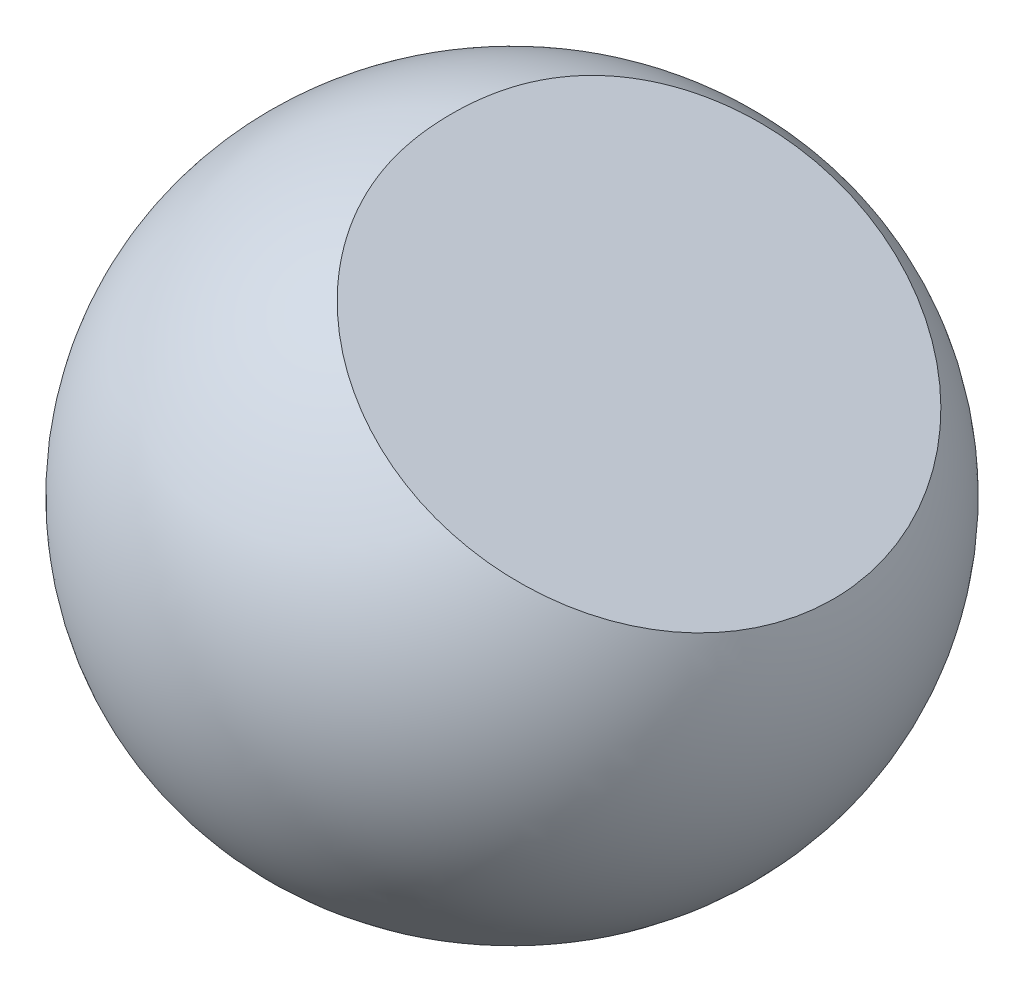
ISO-10303-21;
HEADER;
FILE_DESCRIPTION(('STEP AP214'),'2;1');
FILE_NAME('part.step','',(''),(''),'','','');
FILE_SCHEMA(('AUTOMOTIVE_DESIGN { 1 0 10303 214 1 1 1 1 }'));
ENDSEC;
DATA;
#1=APPLICATION_CONTEXT('core data for automotive mechanical design processes');
#2=APPLICATION_PROTOCOL_DEFINITION('international standard','automotive_design',2000,#1);
#3=PRODUCT_CONTEXT('',#1,'mechanical');
#4=PRODUCT('Part','Part','',(#3));
#5=PRODUCT_RELATED_PRODUCT_CATEGORY('part','',(#4));
#6=PRODUCT_DEFINITION_FORMATION('','',#4);
#7=PRODUCT_DEFINITION_CONTEXT('part definition',#1,'design');
#8=PRODUCT_DEFINITION('design','',#6,#7);
#9=PRODUCT_DEFINITION_SHAPE('','',#8);
#10=(LENGTH_UNIT() NAMED_UNIT(*) SI_UNIT(.MILLI.,.METRE.));
#11=(NAMED_UNIT(*) PLANE_ANGLE_UNIT() SI_UNIT($,.RADIAN.));
#12=(NAMED_UNIT(*) SI_UNIT($,.STERADIAN.) SOLID_ANGLE_UNIT());
#13=UNCERTAINTY_MEASURE_WITH_UNIT(LENGTH_MEASURE(1.E-05),#10,'distance_accuracy_value','');
#14=(GEOMETRIC_REPRESENTATION_CONTEXT(3) GLOBAL_UNCERTAINTY_ASSIGNED_CONTEXT((#13)) GLOBAL_UNIT_ASSIGNED_CONTEXT((#10,
#11,#12)) REPRESENTATION_CONTEXT('',''));
#15=CARTESIAN_POINT('',(0.,0.,0.));
#16=DIRECTION('',(0.,0.,1.));
#17=DIRECTION('',(1.,0.,0.));
#18=AXIS2_PLACEMENT_3D('',#15,#16,#17);
#19=CARTESIAN_POINT('',(0.,4.69373689625829,0.));
#20=DIRECTION('',(0.,-1.,0.));
#21=DIRECTION('',(1.,0.,0.));
#22=AXIS2_PLACEMENT_3D('',#19,#20,#21);
#23=DEGENERATE_TOROIDAL_SURFACE('',#22,4.0728030425194,45.,.T.);
#24=CARTESIAN_POINT('',(9.65832490566805,38.1984521740519,-32.7175326951944));
#25=CARTESIAN_POINT('',(10.328964002421,37.7958451659645,-32.9877501989122));
#26=CARTESIAN_POINT('',(11.0084961629176,37.3878993552277,-33.2278728043592));
#27=CARTESIAN_POINT('',(12.3812888474992,36.5637661394047,-33.6467543926855));
#28=CARTESIAN_POINT('',(13.0745486629442,36.1475791597387,-33.8255165343851));
#29=CARTESIAN_POINT('',(14.470838346536,35.309339912048,-34.1209086318079));
#30=CARTESIAN_POINT('',(15.1738697084079,34.8872867472903,-34.2375289786342));
#31=CARTESIAN_POINT('',(16.5855235262167,34.0398238976073,-34.4081793289771));
#32=CARTESIAN_POINT('',(17.2941463735595,33.6144139777079,-34.462204910995));
#33=CARTESIAN_POINT('',(18.7869256592564,32.7182488050254,-34.5099575054553));
#34=CARTESIAN_POINT('',(19.5712498748351,32.2473928299809,-34.496806047069));
#35=CARTESIAN_POINT('',(21.136268637712,31.3078598907693,-34.3945058937856));
#36=CARTESIAN_POINT('',(21.9169629477703,30.8391830690253,-34.3053522999059));
#37=CARTESIAN_POINT('',(23.4695540989458,29.9071108394399,-34.0519746887222));
#38=CARTESIAN_POINT('',(24.2414485493204,29.4437168668409,-33.8877307466425));
#39=CARTESIAN_POINT('',(25.7709967384066,28.5254780956224,-33.4856355693782));
#40=CARTESIAN_POINT('',(26.5286505355771,28.0706332619082,-33.2477846364254));
#41=CARTESIAN_POINT('',(28.0375036750701,27.1648184189088,-32.6957254483866));
#42=CARTESIAN_POINT('',(28.7883700534512,26.7140482989783,-32.3802788276354));
#43=CARTESIAN_POINT('',(30.2650564569636,25.8275442199886,-31.6777689305062));
#44=CARTESIAN_POINT('',(30.9908761441987,25.3918104637798,-31.2907046884075));
#45=CARTESIAN_POINT('',(32.4126130297227,24.5382944123899,-30.447937308764));
#46=CARTESIAN_POINT('',(33.1085297961986,24.1205123764405,-29.9922331804527));
#47=CARTESIAN_POINT('',(34.4658571424683,23.305663518802,-29.0155947337966));
#48=CARTESIAN_POINT('',(35.1272673925094,22.9085968950746,-28.4946597922516));
#49=CARTESIAN_POINT('',(36.4232116923407,22.1305983266505,-27.3810933326679));
#50=CARTESIAN_POINT('',(37.0570181252579,21.7501031946208,-26.7873096013661));
#51=CARTESIAN_POINT('',(38.2801432748487,21.0158203897896,-25.5403811035118));
#52=CARTESIAN_POINT('',(38.8694614747397,20.6620330272301,-24.8872356475977));
#53=CARTESIAN_POINT('',(39.999778595051,19.9834659764843,-23.5262655806283));
#54=CARTESIAN_POINT('',(40.5407740519263,19.6586883675796,-22.8184370569203));
#55=CARTESIAN_POINT('',(41.5708942401375,19.0402728756195,-21.3531757468554));
#56=CARTESIAN_POINT('',(42.0600184964245,18.7466352777519,-20.5957425063096));
#57=CARTESIAN_POINT('',(42.9912403948453,18.1875917263038,-19.0231016416065));
#58=CARTESIAN_POINT('',(43.4323802276921,17.9227607775708,-18.2071222708368));
#59=CARTESIAN_POINT('',(44.2548529942535,17.4290029555441,-16.535141513249));
#60=CARTESIAN_POINT('',(44.6361852605257,17.2000764829386,-15.6791396799253));
#61=CARTESIAN_POINT('',(45.3365920506939,16.7795989360746,-13.9331026368353));
#62=CARTESIAN_POINT('',(45.6556629053201,16.5880500646013,-13.0430654249468));
#63=CARTESIAN_POINT('',(46.2294725628451,16.2435729970603,-11.2352153892436));
#64=CARTESIAN_POINT('',(46.4842109366335,16.090645058602,-10.3174023802046));
#65=CARTESIAN_POINT('',(46.930731344169,15.8225839715013,-8.44778952712671));
#66=CARTESIAN_POINT('',(47.1216160235484,15.7079895346026,-7.49569799827918));
#67=CARTESIAN_POINT('',(47.434393489053,15.520218794433,-5.57621827786234));
#68=CARTESIAN_POINT('',(47.5562856225357,15.4470428829652,-4.60882994168018));
#69=CARTESIAN_POINT('',(47.7302917050819,15.3425812304577,-2.66551328115275));
#70=CARTESIAN_POINT('',(47.7824027899972,15.3112972088617,-1.68958460792587));
#71=CARTESIAN_POINT('',(47.8165012141775,15.2908267880256,0.263937801679308));
#72=CARTESIAN_POINT('',(47.798488385762,15.3016404894496,1.24153154203352));
#73=CARTESIAN_POINT('',(47.6920817871992,15.3655199180357,3.19838779677885));
#74=CARTESIAN_POINT('',(47.6031951860018,15.4188815081077,4.17761391084347));
#75=CARTESIAN_POINT('',(47.3550084837481,15.5678762597188,6.12385723128897));
#76=CARTESIAN_POINT('',(47.1957079596695,15.6635096752125,7.09087436428662));
#77=CARTESIAN_POINT('',(46.8077381121499,15.8964209091298,9.00580601395829));
#78=CARTESIAN_POINT('',(46.5790679103826,16.0336992548422,9.95372028859879));
#79=CARTESIAN_POINT('',(46.0538714358454,16.3489922079302,11.8236235460165));
#80=CARTESIAN_POINT('',(45.757345371266,16.527006690322,12.7456126083259));
#81=CARTESIAN_POINT('',(45.0988454716284,16.9223261336747,14.5558001678317));
#82=CARTESIAN_POINT('',(44.7369582983513,17.1395790686791,15.4440415456452));
#83=CARTESIAN_POINT('',(43.9498994590239,17.6120767295291,17.1815354676786));
#84=CARTESIAN_POINT('',(43.5247277233848,17.8673214971512,18.0307879690241));
#85=CARTESIAN_POINT('',(42.6139886332502,18.4140685359126,19.684015184882));
#86=CARTESIAN_POINT('',(42.1284225338289,18.7055700535891,20.4879908398025));
#87=CARTESIAN_POINT('',(41.1002154122027,19.3228370678988,22.0446608200086));
#88=CARTESIAN_POINT('',(40.5575748588433,19.6486022830685,22.7973555664642));
#89=CARTESIAN_POINT('',(39.4243462463907,20.3289171996124,24.2389212016003));
#90=CARTESIAN_POINT('',(38.8342575787641,20.6831670996401,24.9283261559791));
#91=CARTESIAN_POINT('',(37.6058399292544,21.4206271686182,26.2459667886965));
#92=CARTESIAN_POINT('',(36.9675111461024,21.8038372182636,26.8742027190042));
#93=CARTESIAN_POINT('',(35.6471112977331,22.5965172677937,28.0646091373366));
#94=CARTESIAN_POINT('',(34.9650422815082,23.0059860376,28.6267827165346));
#95=CARTESIAN_POINT('',(33.5619805310088,23.848290782828,29.680639981958));
#96=CARTESIAN_POINT('',(32.840988249055,24.2811264867065,30.1723244870823));
#97=CARTESIAN_POINT('',(31.376578286404,25.1602606089652,31.0742483710893));
#98=CARTESIAN_POINT('',(30.6336727592638,25.6062515644905,31.4856191617308));
#99=CARTESIAN_POINT('',(29.1204281208179,26.5147027707186,32.2327955619807));
#100=CARTESIAN_POINT('',(28.3500892370501,26.9771628848229,32.5686017981677));
#101=CARTESIAN_POINT('',(26.7875788052816,27.9151899892453,33.161789594374));
#102=CARTESIAN_POINT('',(25.9954087979307,28.39075605466,33.4191766731559));
#103=CARTESIAN_POINT('',(24.3949768643438,29.3515487008816,33.8532590472541));
#104=CARTESIAN_POINT('',(23.5867151466258,29.8367751565081,34.0299553874598));
#105=CARTESIAN_POINT('',(21.9750122839918,30.804334117196,34.2984547413262));
#106=CARTESIAN_POINT('',(21.1717542790343,31.2865566772346,34.3917542733264));
#107=CARTESIAN_POINT('',(19.56133487251,32.2533451364309,34.4978793497477));
#108=CARTESIAN_POINT('',(18.7541735130239,32.7379110103262,34.5107057597929));
#109=CARTESIAN_POINT('',(17.141917212243,33.7058022183846,34.4554111349196));
#110=CARTESIAN_POINT('',(16.3368221884395,34.1891276020805,34.3872933841254));
#111=CARTESIAN_POINT('',(14.7346758029219,35.1509494909538,34.1702455521592));
#112=CARTESIAN_POINT('',(13.9376243405343,35.629446056569,34.021316483706));
#113=CARTESIAN_POINT('',(12.3724632377509,36.5690644471719,33.6469593058851));
#114=CARTESIAN_POINT('',(11.6040912101576,37.0303437919419,33.4230227451696));
#115=CARTESIAN_POINT('',(10.0865621011006,37.941367108717,32.8993815052177));
#116=CARTESIAN_POINT('',(9.33740479184616,38.3911112174725,32.59967772466));
#117=CARTESIAN_POINT('',(7.86404281748776,39.2756195308085,31.926461952425));
#118=CARTESIAN_POINT('',(7.1398332437003,39.7103866822354,31.5529645788171));
#119=CARTESIAN_POINT('',(5.72168112302598,40.5617506797743,30.7346085834303));
#120=CARTESIAN_POINT('',(5.02773824004978,40.9783477276519,30.2897507543136));
#121=CARTESIAN_POINT('',(3.68727619572799,41.783071782262,29.3401560008578));
#122=CARTESIAN_POINT('',(3.0401387764198,42.1715699498614,28.8366060160297));
#123=CARTESIAN_POINT('',(1.78498397654148,42.9250812215905,27.7670538745137));
#124=CARTESIAN_POINT('',(1.17696609052007,43.2900946291593,27.201052524997));
#125=CARTESIAN_POINT('',(0.00435774837195032,43.9940505103126,26.0103573146809));
#126=CARTESIAN_POINT('',(-0.560216672535823,44.3329833574205,25.3856419694302));
#127=CARTESIAN_POINT('',(-1.64149337484003,44.9821098102876,24.0821852042348));
#128=CARTESIAN_POINT('',(-2.15819586387152,45.2923035406972,23.4034440186401));
#129=CARTESIAN_POINT('',(-3.13398303759876,45.8781011126647,22.0054449582273));
#130=CARTESIAN_POINT('',(-3.59369028998732,46.1540787023643,21.2867780266136));
#131=CARTESIAN_POINT('',(-4.45950437101717,46.673855760414,19.8068153729074));
#132=CARTESIAN_POINT('',(-4.86561244917038,46.9176559788877,19.0455206451499));
#133=CARTESIAN_POINT('',(-5.62101757971451,47.3711508630583,17.4872047810058));
#134=CARTESIAN_POINT('',(-5.97040833047651,47.5809017790111,16.6902454009142));
#135=CARTESIAN_POINT('',(-6.61137749099854,47.9656969352188,15.065318413944));
#136=CARTESIAN_POINT('',(-6.90295488305262,48.1407405645109,14.2373502615134));
#137=CARTESIAN_POINT('',(-7.42875735916519,48.4563973205479,12.5524159101038));
#138=CARTESIAN_POINT('',(-7.66269197171355,48.5968360675613,11.6953266538849));
#139=CARTESIAN_POINT('',(-8.07188791212659,48.8424900326952,9.96247971467922));
#140=CARTESIAN_POINT('',(-8.2471550200782,48.9477087207946,9.08672387982437));
#141=CARTESIAN_POINT('',(-8.54201987790511,49.1247259253903,7.31998033183036));
#142=CARTESIAN_POINT('',(-8.66144945781158,49.1964234838478,6.42895487799653));
#143=CARTESIAN_POINT('',(-8.84891829600601,49.3089672774031,4.63947467122672));
#144=CARTESIAN_POINT('',(-8.91694442766428,49.3498056321475,3.74101807981562));
#145=CARTESIAN_POINT('',(-8.98854233129954,49.3927882406884,2.32251024335245));
#146=CARTESIAN_POINT('',(-9.00721078583304,49.4039955363288,1.8033950516464));
#147=CARTESIAN_POINT('',(-9.03038169787396,49.4179058073175,0.764703516503964));
#148=CARTESIAN_POINT('',(-9.03488372827947,49.4206085262622,0.245127159636339));
#149=CARTESIAN_POINT('',(-9.02995936770914,49.4176522684396,-0.793984485625912));
#150=CARTESIAN_POINT('',(-9.02053154945979,49.4119924348323,-1.31351976435685));
#151=CARTESIAN_POINT('',(-8.98726198074726,49.3920196035665,-2.35196469988608));
#152=CARTESIAN_POINT('',(-8.96342048460613,49.3777067585859,-2.87087436756109));
#153=CARTESIAN_POINT('',(-8.9003774443933,49.3398599197665,-3.90639686656439));
#154=CARTESIAN_POINT('',(-8.86120668837348,49.3163444090216,-4.42301221553278));
#155=CARTESIAN_POINT('',(-8.766311790075,49.2593758378904,-5.45418617314896));
#156=CARTESIAN_POINT('',(-8.71058766766177,49.2259227894301,-5.96874478426425));
#157=CARTESIAN_POINT('',(-8.5814949358937,49.1484241187522,-6.99468933794086));
#158=CARTESIAN_POINT('',(-8.50813235817588,49.1043821175274,-7.50607630388709));
#159=CARTESIAN_POINT('',(-8.34289255538305,49.0051831550132,-8.52473181700072));
#160=CARTESIAN_POINT('',(-8.2510158170959,48.9500264859587,-9.03200047208506));
#161=CARTESIAN_POINT('',(-7.9701191436174,48.7813948481099,-10.4291005453848));
#162=CARTESIAN_POINT('',(-7.76068875651889,48.6556668045757,-11.3135011004006));
#163=CARTESIAN_POINT('',(-7.28024592064858,48.3672409528124,-13.0593239714731));
#164=CARTESIAN_POINT('',(-7.00922787837951,48.2045397866204,-13.920744192471));
#165=CARTESIAN_POINT('',(-6.40589803944043,47.8423407700089,-15.6138804011877));
#166=CARTESIAN_POINT('',(-6.07358996817991,47.642845156077,-16.4455981906523));
#167=CARTESIAN_POINT('',(-5.34921307725886,47.2079775585966,-18.0728423119397));
#168=CARTESIAN_POINT('',(-4.95714542195375,46.9726062740496,-18.868369348511));
#169=CARTESIAN_POINT('',(-4.11505743784724,46.4670727829827,-20.4182900551311));
#170=CARTESIAN_POINT('',(-3.6649481321171,46.1968571606462,-21.1726179863336));
#171=CARTESIAN_POINT('',(-2.71043133208375,45.623828903136,-22.6330276648468));
#172=CARTESIAN_POINT('',(-2.20602251662051,45.3210154748259,-23.3391082375687));
#173=CARTESIAN_POINT('',(-1.14646146273604,44.6849256496789,-24.6979389775487));
#174=CARTESIAN_POINT('',(-0.591288776050185,44.351636977067,-25.3506674516871));
#175=CARTESIAN_POINT('',(0.565392670787946,43.657242542152,-26.5976097405805));
#176=CARTESIAN_POINT('',(1.16689954577765,43.2961379115748,-27.1918259337396));
#177=CARTESIAN_POINT('',(2.38121074177407,42.567146416933,-28.2899142929555));
#178=CARTESIAN_POINT('',(2.99202637748273,42.2004534269533,-28.7967824253166));
#179=CARTESIAN_POINT('',(4.24719620821682,41.4469331317004,-29.7504366121617));
#180=CARTESIAN_POINT('',(4.89154949986345,41.0601063687557,-30.1972242838275));
#181=CARTESIAN_POINT('',(6.20907355805876,40.2691527519424,-31.0277309723562));
#182=CARTESIAN_POINT('',(6.88223087468032,39.8650339725135,-31.4114790288475));
#183=CARTESIAN_POINT('',(8.25306755169809,39.042075013242,-32.1138284973199));
#184=CARTESIAN_POINT('',(8.95074636799662,38.6232351600395,-32.4324313537135));
#185=CARTESIAN_POINT('',(9.65832490566805,38.1984521740519,-32.7175326951944));
#186=B_SPLINE_CURVE_WITH_KNOTS('',3,(#24,#25,#26,#27,#28,#29,#30,#31,#32,#33,#34,#35,#36,#37,
#38,#39,#40,#41,#42,#43,#44,#45,#46,#47,#48,#49,#50,#51,#52,#53,#54,#55,#56,#57,#58,#59,#60,#61,
#62,#63,#64,#65,#66,#67,#68,#69,#70,#71,#72,#73,#74,#75,#76,#77,#78,#79,#80,#81,#82,#83,#84,#85,
#86,#87,#88,#89,#90,#91,#92,#93,#94,#95,#96,#97,#98,#99,#100,#101,#102,#103,#104,#105,#106,#107,
#108,#109,#110,#111,#112,#113,#114,#115,#116,#117,#118,#119,#120,#121,#122,#123,#124,#125,#126,
#127,#128,#129,#130,#131,#132,#133,#134,#135,#136,#137,#138,#139,#140,#141,#142,#143,#144,#145,
#146,#147,#148,#149,#150,#151,#152,#153,#154,#155,#156,#157,#158,#159,#160,#161,#162,#163,#164,
#165,#166,#167,#168,#169,#170,#171,#172,#173,#174,#175,#176,#177,#178,#179,#180,#181,#182,#183,
#184,#185),.UNSPECIFIED.,.T.,.F.,(4,2,2,2,2,2,2,2,2,2,2,2,2,2,2,2,2,2,2,2,2,2,2,2,2,2,2,2,2,2,2,
2,2,2,2,2,2,2,2,2,2,2,2,2,2,2,2,2,2,2,2,2,2,2,2,2,2,2,2,2,2,2,2,2,2,2,2,2,2,2,2,2,2,2,2,2,2,2,2,
2,4),(0.,2.48205480947921,4.96398182426444,7.4462925045892,9.92877851689962,12.670243778695,
15.4118857645568,18.1542556513534,20.8966142780775,23.6859558998913,26.4753351370425,
29.2647546407011,32.0542007958678,34.8954709250989,37.7367740539202,40.5782806707305,
43.4198133084905,46.3104092984477,49.2010375446781,52.0918360937266,54.9826539244734,
57.9125399221529,60.8424536349478,63.7724876017388,66.7025285748329,69.6531235831,
72.6037363177604,75.5543864132577,78.5050274559014,81.451784609563,84.398545003559,
87.3452441702407,90.2919191327751,93.2108579982263,96.1297848394033,99.0485750444489,
101.967331338032,104.841413087421,107.715471004152,110.589326611782,113.463145003909,
116.284293939746,119.105412529323,121.926416662372,124.747385443708,127.51529495679,
130.2831716411,133.05050057434,135.8177987706,138.536565926898,141.255297947797,
143.975028701285,146.694747657925,149.381495140026,152.068179977204,154.750380155634,
157.43262754545,160.128126821366,162.823360450922,165.526660036986,168.23064971745,
169.78914291829,171.347683105513,172.906382994212,174.465055381245,176.020613187795,
177.576169127552,179.131193884889,180.686177761709,183.435545431673,186.185162903829,
188.934613300241,191.684010133222,194.437673000534,197.191402882299,199.9462469258,
202.700978944276,205.321086653396,207.94112382312,210.559950649658,213.178719404738),.UNSPECIFIED.);
#187=CARTESIAN_POINT('',(9.65832490566805,38.1984521740519,-32.7175326951944));
#188=VERTEX_POINT('',#187);
#189=EDGE_CURVE('E42',#188,#188,#186,.T.);
#190=ORIENTED_EDGE('',*,*,#189,.T.);
#191=EDGE_LOOP('',(#190));
#192=FACE_BOUND('',#191,.T.);
#193=CARTESIAN_POINT('',(0.,-35.,0.));
#194=DIRECTION('',(0.,-1.,0.));
#195=DIRECTION('',(1.,0.,0.));
#196=AXIS2_PLACEMENT_3D('',#193,#194,#195);
#197=CIRCLE('',#196,25.272030651341);
#198=CARTESIAN_POINT('',(25.272030651341,-35.,0.));
#199=VERTEX_POINT('',#198);
#200=EDGE_CURVE('E10',#199,#199,#197,.T.);
#201=ORIENTED_EDGE('',*,*,#200,.F.);
#202=EDGE_LOOP('',(#201));
#203=FACE_BOUND('',#202,.T.);
#204=ADVANCED_FACE('F38',(#192,#203),#23,.T.);
#205=CARTESIAN_POINT('',(0.,-35.,0.));
#206=DIRECTION('',(0.,1.,0.));
#207=DIRECTION('',(-1.,0.,0.));
#208=AXIS2_PLACEMENT_3D('',#205,#206,#207);
#209=PLANE('',#208);
#210=ORIENTED_EDGE('',*,*,#200,.T.);
#211=EDGE_LOOP('',(#210));
#212=FACE_BOUND('',#211,.T.);
#213=ADVANCED_FACE('F59',(#212),#209,.F.);
#214=CARTESIAN_POINT('',(-10.,50.,-49.0728030425194));
#215=DIRECTION('',(-0.514705882352941,-0.857366814538142,0.));
#216=DIRECTION('',(0.857366814538142,-0.514705882352941,0.));
#217=AXIS2_PLACEMENT_3D('',#214,#215,#216);
#218=PLANE('',#217);
#219=ORIENTED_EDGE('',*,*,#189,.F.);
#220=EDGE_LOOP('',(#219));
#221=FACE_BOUND('',#220,.T.);
#222=ADVANCED_FACE('F57',(#221),#218,.F.);
#223=CLOSED_SHELL('',(#204,#213,#222));
#224=MANIFOLD_SOLID_BREP('B2',#223);
#225=ADVANCED_BREP_SHAPE_REPRESENTATION('',(#18,#224),#14);
#226=SHAPE_DEFINITION_REPRESENTATION(#9,#225);
ENDSEC;
END-ISO-10303-21;
